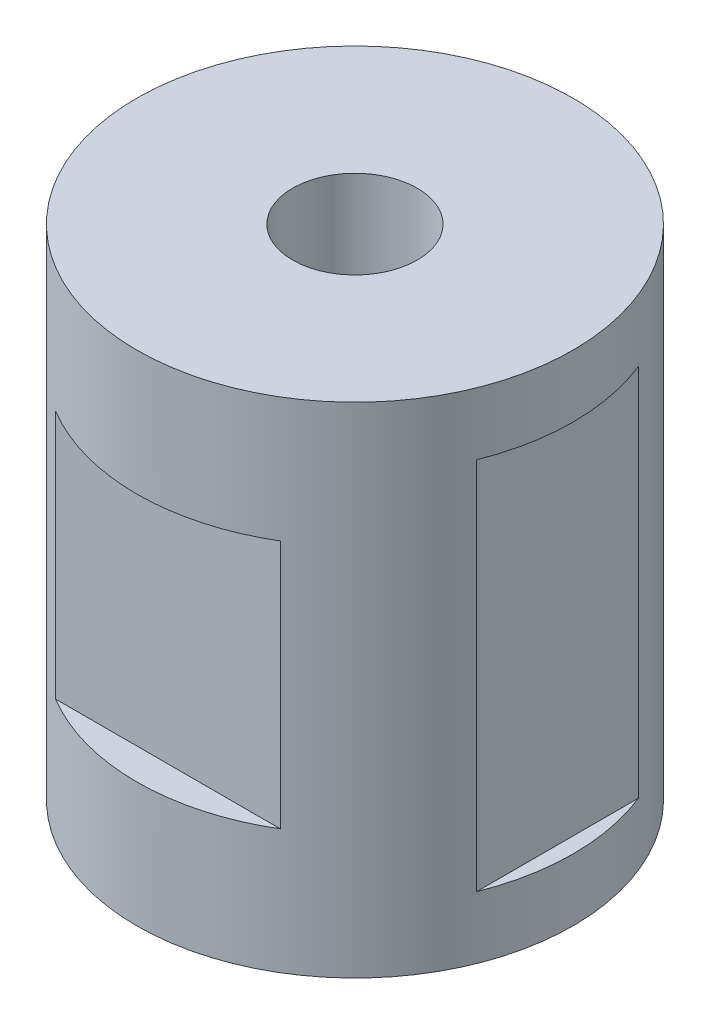
ISO-10303-21;
HEADER;
FILE_DESCRIPTION(('STEP AP214'),'2;1');
FILE_NAME('part.step','',(''),(''),'','','');
FILE_SCHEMA(('AUTOMOTIVE_DESIGN { 1 0 10303 214 1 1 1 1 }'));
ENDSEC;
DATA;
#1=APPLICATION_CONTEXT('core data for automotive mechanical design processes');
#2=APPLICATION_PROTOCOL_DEFINITION('international standard','automotive_design',2000,#1);
#3=PRODUCT_CONTEXT('',#1,'mechanical');
#4=PRODUCT('Part','Part','',(#3));
#5=PRODUCT_RELATED_PRODUCT_CATEGORY('part','',(#4));
#6=PRODUCT_DEFINITION_FORMATION('','',#4);
#7=PRODUCT_DEFINITION_CONTEXT('part definition',#1,'design');
#8=PRODUCT_DEFINITION('design','',#6,#7);
#9=PRODUCT_DEFINITION_SHAPE('','',#8);
#10=(LENGTH_UNIT() NAMED_UNIT(*) SI_UNIT(.MILLI.,.METRE.));
#11=(NAMED_UNIT(*) PLANE_ANGLE_UNIT() SI_UNIT($,.RADIAN.));
#12=(NAMED_UNIT(*) SI_UNIT($,.STERADIAN.) SOLID_ANGLE_UNIT());
#13=UNCERTAINTY_MEASURE_WITH_UNIT(LENGTH_MEASURE(1.E-05),#10,'distance_accuracy_value','');
#14=(GEOMETRIC_REPRESENTATION_CONTEXT(3) GLOBAL_UNCERTAINTY_ASSIGNED_CONTEXT((#13)) GLOBAL_UNIT_ASSIGNED_CONTEXT((#10,
#11,#12)) REPRESENTATION_CONTEXT('',''));
#15=CARTESIAN_POINT('',(0.,0.,0.));
#16=DIRECTION('',(0.,0.,1.));
#17=DIRECTION('',(1.,0.,0.));
#18=AXIS2_PLACEMENT_3D('',#15,#16,#17);
#19=CARTESIAN_POINT('',(0.,80.,0.));
#20=DIRECTION('',(0.,-1.,0.));
#21=DIRECTION('',(0.,0.,-1.));
#22=AXIS2_PLACEMENT_3D('',#19,#20,#21);
#23=CYLINDRICAL_SURFACE('',#22,35.);
#24=CARTESIAN_POINT('',(0.,60.,0.));
#25=DIRECTION('',(0.,1.,0.));
#26=DIRECTION('',(0.,0.,1.));
#27=AXIS2_PLACEMENT_3D('',#24,#25,#26);
#28=CIRCLE('',#27,35.);
#29=CARTESIAN_POINT('',(-18.0277563773199,60.,30.));
#30=VERTEX_POINT('',#29);
#31=CARTESIAN_POINT('',(18.0277563773199,60.,30.));
#32=VERTEX_POINT('',#31);
#33=EDGE_CURVE('E92',#30,#32,#28,.T.);
#34=ORIENTED_EDGE('',*,*,#33,.T.);
#35=DIRECTION('',(0.,-1.,0.));
#36=VECTOR('',#35,1.);
#37=CARTESIAN_POINT('',(18.0277563773199,80.,30.));
#38=LINE('',#37,#36);
#39=CARTESIAN_POINT('',(18.0277563773199,20.,30.));
#40=VERTEX_POINT('',#39);
#41=EDGE_CURVE('E11',#40,#32,#38,.F.);
#42=ORIENTED_EDGE('',*,*,#41,.F.);
#43=CARTESIAN_POINT('',(0.,20.,0.));
#44=DIRECTION('',(0.,-1.,0.));
#45=DIRECTION('',(1.,0.,0.));
#46=AXIS2_PLACEMENT_3D('',#43,#44,#45);
#47=CIRCLE('',#46,35.);
#48=CARTESIAN_POINT('',(-18.0277563773199,20.,30.));
#49=VERTEX_POINT('',#48);
#50=EDGE_CURVE('E52',#40,#49,#47,.T.);
#51=ORIENTED_EDGE('',*,*,#50,.T.);
#52=DIRECTION('',(0.,-1.,0.));
#53=VECTOR('',#52,1.);
#54=CARTESIAN_POINT('',(-18.0277563773199,80.,30.));
#55=LINE('',#54,#53);
#56=EDGE_CURVE('E46',#30,#49,#55,.T.);
#57=ORIENTED_EDGE('',*,*,#56,.F.);
#58=EDGE_LOOP('',(#34,#42,#51,#57));
#59=FACE_BOUND('',#58,.T.);
#60=CARTESIAN_POINT('',(0.,0.,0.));
#61=DIRECTION('',(0.,1.,0.));
#62=DIRECTION('',(0.,0.,1.));
#63=AXIS2_PLACEMENT_3D('',#60,#61,#62);
#64=CIRCLE('',#63,35.);
#65=CARTESIAN_POINT('',(0.,0.,35.));
#66=VERTEX_POINT('',#65);
#67=EDGE_CURVE('E132',#66,#66,#64,.T.);
#68=ORIENTED_EDGE('',*,*,#67,.T.);
#69=EDGE_LOOP('',(#68));
#70=FACE_BOUND('',#69,.T.);
#71=CARTESIAN_POINT('',(0.,80.,0.));
#72=DIRECTION('',(0.,1.,0.));
#73=DIRECTION('',(0.,0.,1.));
#74=AXIS2_PLACEMENT_3D('',#71,#72,#73);
#75=CIRCLE('',#74,35.);
#76=CARTESIAN_POINT('',(0.,80.,35.));
#77=VERTEX_POINT('',#76);
#78=EDGE_CURVE('E135',#77,#77,#75,.T.);
#79=ORIENTED_EDGE('',*,*,#78,.F.);
#80=EDGE_LOOP('',(#79));
#81=FACE_BOUND('',#80,.T.);
#82=DIRECTION('',(0.,-1.,0.));
#83=VECTOR('',#82,1.);
#84=CARTESIAN_POINT('',(32.5001523073354,80.,-12.99));
#85=LINE('',#84,#83);
#86=CARTESIAN_POINT('',(32.5001523073354,70.,-12.99));
#87=VERTEX_POINT('',#86);
#88=CARTESIAN_POINT('',(32.5001523073354,9.99999999999999,-12.99));
#89=VERTEX_POINT('',#88);
#90=EDGE_CURVE('E149',#87,#89,#85,.T.);
#91=ORIENTED_EDGE('',*,*,#90,.T.);
#92=CARTESIAN_POINT('',(0.,9.99999999999999,0.));
#93=DIRECTION('',(0.,-1.,0.));
#94=DIRECTION('',(0.,0.,-1.));
#95=AXIS2_PLACEMENT_3D('',#92,#93,#94);
#96=CIRCLE('',#95,35.);
#97=CARTESIAN_POINT('',(32.5001523073354,9.99999999999999,12.99));
#98=VERTEX_POINT('',#97);
#99=EDGE_CURVE('E138',#89,#98,#96,.T.);
#100=ORIENTED_EDGE('',*,*,#99,.T.);
#101=DIRECTION('',(0.,-1.,0.));
#102=VECTOR('',#101,1.);
#103=CARTESIAN_POINT('',(32.5001523073354,80.,12.99));
#104=LINE('',#103,#102);
#105=CARTESIAN_POINT('',(32.5001523073354,70.,12.99));
#106=VERTEX_POINT('',#105);
#107=EDGE_CURVE('E146',#98,#106,#104,.F.);
#108=ORIENTED_EDGE('',*,*,#107,.T.);
#109=CARTESIAN_POINT('',(0.,70.,0.));
#110=DIRECTION('',(0.,1.,0.));
#111=DIRECTION('',(0.,0.,1.));
#112=AXIS2_PLACEMENT_3D('',#109,#110,#111);
#113=CIRCLE('',#112,35.);
#114=EDGE_CURVE('E143',#106,#87,#113,.T.);
#115=ORIENTED_EDGE('',*,*,#114,.T.);
#116=EDGE_LOOP('',(#91,#100,#108,#115));
#117=FACE_BOUND('',#116,.T.);
#118=ADVANCED_FACE('F39',(#59,#70,#81,#117),#23,.T.);
#119=CARTESIAN_POINT('',(0.,80.,0.));
#120=DIRECTION('',(0.,1.,0.));
#121=DIRECTION('',(0.,0.,1.));
#122=AXIS2_PLACEMENT_3D('',#119,#120,#121);
#123=PLANE('',#122);
#124=ORIENTED_EDGE('',*,*,#78,.T.);
#125=EDGE_LOOP('',(#124));
#126=FACE_BOUND('',#125,.T.);
#127=CARTESIAN_POINT('',(0.,80.,0.));
#128=DIRECTION('',(0.,1.,0.));
#129=DIRECTION('',(0.,0.,1.));
#130=AXIS2_PLACEMENT_3D('',#127,#128,#129);
#131=CIRCLE('',#130,10.);
#132=CARTESIAN_POINT('',(0.,80.,10.));
#133=VERTEX_POINT('',#132);
#134=EDGE_CURVE('E129',#133,#133,#131,.T.);
#135=ORIENTED_EDGE('',*,*,#134,.F.);
#136=EDGE_LOOP('',(#135));
#137=FACE_BOUND('',#136,.T.);
#138=ADVANCED_FACE('F164',(#126,#137),#123,.T.);
#139=CARTESIAN_POINT('',(0.,0.,0.));
#140=DIRECTION('',(0.,1.,0.));
#141=DIRECTION('',(0.,0.,1.));
#142=AXIS2_PLACEMENT_3D('',#139,#140,#141);
#143=PLANE('',#142);
#144=ORIENTED_EDGE('',*,*,#67,.F.);
#145=EDGE_LOOP('',(#144));
#146=FACE_BOUND('',#145,.T.);
#147=CARTESIAN_POINT('',(0.,0.,0.));
#148=DIRECTION('',(0.,1.,0.));
#149=DIRECTION('',(0.,0.,1.));
#150=AXIS2_PLACEMENT_3D('',#147,#148,#149);
#151=CIRCLE('',#150,10.);
#152=CARTESIAN_POINT('',(0.,0.,10.));
#153=VERTEX_POINT('',#152);
#154=EDGE_CURVE('E121',#153,#153,#151,.T.);
#155=ORIENTED_EDGE('',*,*,#154,.T.);
#156=EDGE_LOOP('',(#155));
#157=FACE_BOUND('',#156,.T.);
#158=ADVANCED_FACE('F169',(#146,#157),#143,.F.);
#159=CARTESIAN_POINT('',(0.,80.,0.));
#160=DIRECTION('',(0.,-1.,0.));
#161=DIRECTION('',(0.,0.,-1.));
#162=AXIS2_PLACEMENT_3D('',#159,#160,#161);
#163=CYLINDRICAL_SURFACE('',#162,10.);
#164=ORIENTED_EDGE('',*,*,#134,.T.);
#165=EDGE_LOOP('',(#164));
#166=FACE_BOUND('',#165,.T.);
#167=ORIENTED_EDGE('',*,*,#154,.F.);
#168=EDGE_LOOP('',(#167));
#169=FACE_BOUND('',#168,.T.);
#170=ADVANCED_FACE('F175',(#166,#169),#163,.F.);
#171=CARTESIAN_POINT('',(32.5,70.,12.99));
#172=DIRECTION('',(0.,0.,1.));
#173=DIRECTION('',(0.,-1.,0.));
#174=AXIS2_PLACEMENT_3D('',#171,#172,#173);
#175=PLANE('',#174);
#176=DIRECTION('',(1.,0.,0.));
#177=VECTOR('',#176,1.);
#178=CARTESIAN_POINT('',(32.5,10.,12.99));
#179=LINE('',#178,#177);
#180=CARTESIAN_POINT('',(32.5,10.,12.99));
#181=VERTEX_POINT('',#180);
#182=EDGE_CURVE('E60',#181,#98,#179,.T.);
#183=ORIENTED_EDGE('',*,*,#182,.F.);
#184=DIRECTION('',(0.,-1.,0.));
#185=VECTOR('',#184,1.);
#186=CARTESIAN_POINT('',(32.5,70.,12.99));
#187=LINE('',#186,#185);
#188=CARTESIAN_POINT('',(32.5,70.,12.99));
#189=VERTEX_POINT('',#188);
#190=EDGE_CURVE('E103',#189,#181,#187,.T.);
#191=ORIENTED_EDGE('',*,*,#190,.F.);
#192=DIRECTION('',(1.,0.,0.));
#193=VECTOR('',#192,1.);
#194=CARTESIAN_POINT('',(32.5,70.,12.99));
#195=LINE('',#194,#193);
#196=EDGE_CURVE('E118',#189,#106,#195,.T.);
#197=ORIENTED_EDGE('',*,*,#196,.T.);
#198=ORIENTED_EDGE('',*,*,#107,.F.);
#199=EDGE_LOOP('',(#183,#191,#197,#198));
#200=FACE_BOUND('',#199,.T.);
#201=ADVANCED_FACE('F181',(#200),#175,.F.);
#202=CARTESIAN_POINT('',(32.5,70.,12.99));
#203=DIRECTION('',(0.,1.,0.));
#204=DIRECTION('',(0.,0.,1.));
#205=AXIS2_PLACEMENT_3D('',#202,#203,#204);
#206=PLANE('',#205);
#207=ORIENTED_EDGE('',*,*,#196,.F.);
#208=DIRECTION('',(0.,0.,1.));
#209=VECTOR('',#208,1.);
#210=CARTESIAN_POINT('',(32.5,70.,12.99));
#211=LINE('',#210,#209);
#212=CARTESIAN_POINT('',(32.5,70.,-12.99));
#213=VERTEX_POINT('',#212);
#214=EDGE_CURVE('E115',#213,#189,#211,.T.);
#215=ORIENTED_EDGE('',*,*,#214,.F.);
#216=DIRECTION('',(1.,0.,0.));
#217=VECTOR('',#216,1.);
#218=CARTESIAN_POINT('',(32.5,70.,-12.99));
#219=LINE('',#218,#217);
#220=EDGE_CURVE('E122',#213,#87,#219,.T.);
#221=ORIENTED_EDGE('',*,*,#220,.T.);
#222=ORIENTED_EDGE('',*,*,#114,.F.);
#223=EDGE_LOOP('',(#207,#215,#221,#222));
#224=FACE_BOUND('',#223,.T.);
#225=ADVANCED_FACE('F185',(#224),#206,.F.);
#226=CARTESIAN_POINT('',(32.5,70.,-12.99));
#227=DIRECTION('',(0.,0.,-1.));
#228=DIRECTION('',(0.,1.,0.));
#229=AXIS2_PLACEMENT_3D('',#226,#227,#228);
#230=PLANE('',#229);
#231=ORIENTED_EDGE('',*,*,#220,.F.);
#232=DIRECTION('',(0.,1.,0.));
#233=VECTOR('',#232,1.);
#234=CARTESIAN_POINT('',(32.5,70.,-12.99));
#235=LINE('',#234,#233);
#236=CARTESIAN_POINT('',(32.5,10.,-12.99));
#237=VERTEX_POINT('',#236);
#238=EDGE_CURVE('E112',#237,#213,#235,.T.);
#239=ORIENTED_EDGE('',*,*,#238,.F.);
#240=DIRECTION('',(1.,0.,0.));
#241=VECTOR('',#240,1.);
#242=CARTESIAN_POINT('',(32.5,10.,-12.99));
#243=LINE('',#242,#241);
#244=EDGE_CURVE('E125',#237,#89,#243,.T.);
#245=ORIENTED_EDGE('',*,*,#244,.T.);
#246=ORIENTED_EDGE('',*,*,#90,.F.);
#247=EDGE_LOOP('',(#231,#239,#245,#246));
#248=FACE_BOUND('',#247,.T.);
#249=ADVANCED_FACE('F190',(#248),#230,.F.);
#250=CARTESIAN_POINT('',(32.5,10.,12.99));
#251=DIRECTION('',(0.,-1.,0.));
#252=DIRECTION('',(0.,0.,-1.));
#253=AXIS2_PLACEMENT_3D('',#250,#251,#252);
#254=PLANE('',#253);
#255=ORIENTED_EDGE('',*,*,#244,.F.);
#256=DIRECTION('',(0.,0.,-1.));
#257=VECTOR('',#256,1.);
#258=CARTESIAN_POINT('',(32.5,10.,12.99));
#259=LINE('',#258,#257);
#260=EDGE_CURVE('E106',#181,#237,#259,.T.);
#261=ORIENTED_EDGE('',*,*,#260,.F.);
#262=ORIENTED_EDGE('',*,*,#182,.T.);
#263=ORIENTED_EDGE('',*,*,#99,.F.);
#264=EDGE_LOOP('',(#255,#261,#262,#263));
#265=FACE_BOUND('',#264,.T.);
#266=ADVANCED_FACE('F187',(#265),#254,.F.);
#267=CARTESIAN_POINT('',(32.5,0.,0.));
#268=DIRECTION('',(1.,0.,0.));
#269=DIRECTION('',(0.,0.,-1.));
#270=AXIS2_PLACEMENT_3D('',#267,#268,#269);
#271=PLANE('',#270);
#272=ORIENTED_EDGE('',*,*,#190,.T.);
#273=ORIENTED_EDGE('',*,*,#260,.T.);
#274=ORIENTED_EDGE('',*,*,#238,.T.);
#275=ORIENTED_EDGE('',*,*,#214,.T.);
#276=EDGE_LOOP('',(#272,#273,#274,#275));
#277=FACE_BOUND('',#276,.T.);
#278=ADVANCED_FACE('F160',(#277),#271,.T.);
#279=CARTESIAN_POINT('',(-18.03,60.,30.));
#280=DIRECTION('',(0.,1.,0.));
#281=DIRECTION('',(0.,0.,1.));
#282=AXIS2_PLACEMENT_3D('',#279,#280,#281);
#283=PLANE('',#282);
#284=ORIENTED_EDGE('',*,*,#33,.F.);
#285=DIRECTION('',(-1.,0.,0.));
#286=VECTOR('',#285,1.);
#287=CARTESIAN_POINT('',(-18.03,60.,30.));
#288=LINE('',#287,#286);
#289=EDGE_CURVE('E100',#32,#30,#288,.T.);
#290=ORIENTED_EDGE('',*,*,#289,.F.);
#291=EDGE_LOOP('',(#284,#290));
#292=FACE_BOUND('',#291,.T.);
#293=ADVANCED_FACE('F102',(#292),#283,.F.);
#294=CARTESIAN_POINT('',(-18.03,20.,30.));
#295=DIRECTION('',(0.,-1.,0.));
#296=DIRECTION('',(1.,0.,0.));
#297=AXIS2_PLACEMENT_3D('',#294,#295,#296);
#298=PLANE('',#297);
#299=DIRECTION('',(1.,0.,0.));
#300=VECTOR('',#299,1.);
#301=CARTESIAN_POINT('',(-18.03,20.,30.));
#302=LINE('',#301,#300);
#303=EDGE_CURVE('E101',#49,#40,#302,.T.);
#304=ORIENTED_EDGE('',*,*,#303,.F.);
#305=ORIENTED_EDGE('',*,*,#50,.F.);
#306=EDGE_LOOP('',(#304,#305));
#307=FACE_BOUND('',#306,.T.);
#308=ADVANCED_FACE('F152',(#307),#298,.F.);
#309=CARTESIAN_POINT('',(0.,0.,30.));
#310=DIRECTION('',(0.,0.,1.));
#311=DIRECTION('',(1.,0.,0.));
#312=AXIS2_PLACEMENT_3D('',#309,#310,#311);
#313=PLANE('',#312);
#314=ORIENTED_EDGE('',*,*,#56,.T.);
#315=ORIENTED_EDGE('',*,*,#303,.T.);
#316=ORIENTED_EDGE('',*,*,#41,.T.);
#317=ORIENTED_EDGE('',*,*,#289,.T.);
#318=EDGE_LOOP('',(#314,#315,#316,#317));
#319=FACE_BOUND('',#318,.T.);
#320=ADVANCED_FACE('F99',(#319),#313,.T.);
#321=CLOSED_SHELL('',(#118,#138,#158,#170,#201,#225,#249,#266,#278,#293,#308,#320));
#322=MANIFOLD_SOLID_BREP('B2',#321);
#323=ADVANCED_BREP_SHAPE_REPRESENTATION('',(#18,#322),#14);
#324=SHAPE_DEFINITION_REPRESENTATION(#9,#323);
ENDSEC;
END-ISO-10303-21;
